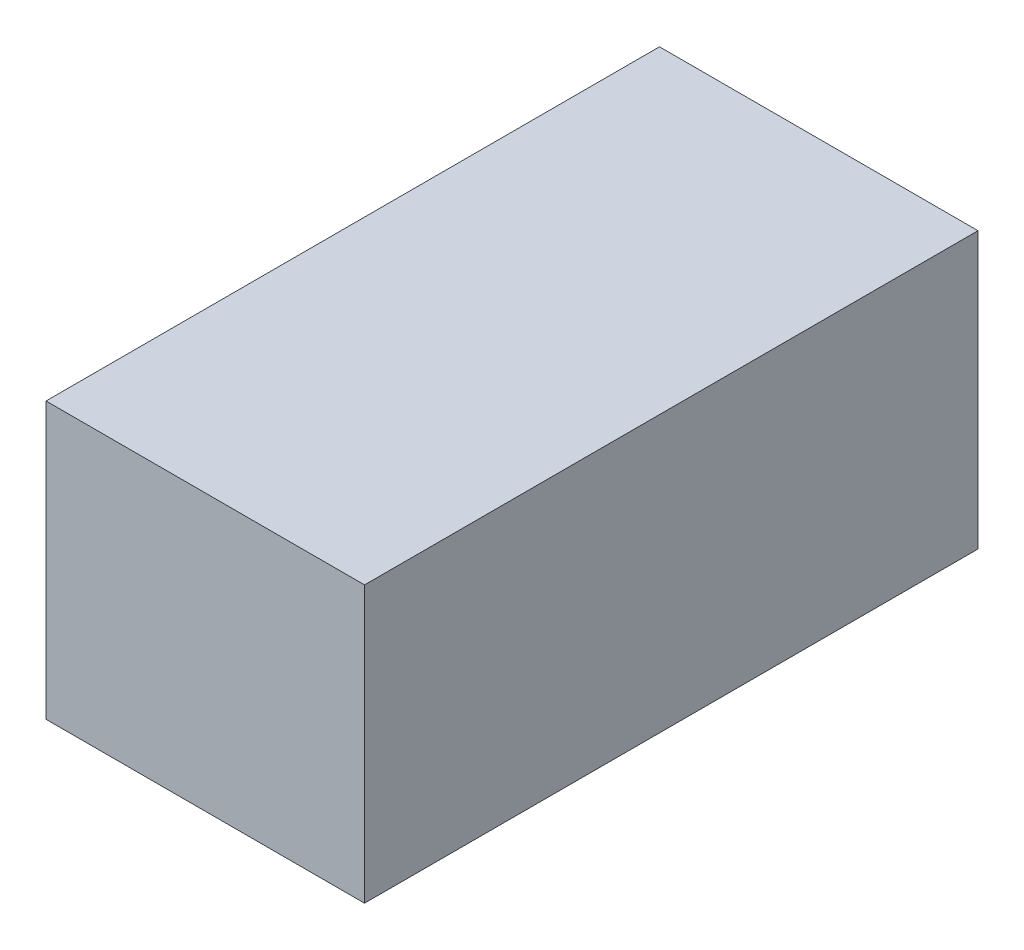
ISO-10303-21;
HEADER;
FILE_DESCRIPTION(('STEP AP214'),'2;1');
FILE_NAME('part.step','',(''),(''),'','','');
FILE_SCHEMA(('AUTOMOTIVE_DESIGN { 1 0 10303 214 1 1 1 1 }'));
ENDSEC;
DATA;
#1=APPLICATION_CONTEXT('core data for automotive mechanical design processes');
#2=APPLICATION_PROTOCOL_DEFINITION('international standard','automotive_design',2000,#1);
#3=PRODUCT_CONTEXT('',#1,'mechanical');
#4=PRODUCT('Part','Part','',(#3));
#5=PRODUCT_RELATED_PRODUCT_CATEGORY('part','',(#4));
#6=PRODUCT_DEFINITION_FORMATION('','',#4);
#7=PRODUCT_DEFINITION_CONTEXT('part definition',#1,'design');
#8=PRODUCT_DEFINITION('design','',#6,#7);
#9=PRODUCT_DEFINITION_SHAPE('','',#8);
#10=(LENGTH_UNIT() NAMED_UNIT(*) SI_UNIT(.MILLI.,.METRE.));
#11=(NAMED_UNIT(*) PLANE_ANGLE_UNIT() SI_UNIT($,.RADIAN.));
#12=(NAMED_UNIT(*) SI_UNIT($,.STERADIAN.) SOLID_ANGLE_UNIT());
#13=UNCERTAINTY_MEASURE_WITH_UNIT(LENGTH_MEASURE(1.E-05),#10,'distance_accuracy_value','');
#14=(GEOMETRIC_REPRESENTATION_CONTEXT(3) GLOBAL_UNCERTAINTY_ASSIGNED_CONTEXT((#13)) GLOBAL_UNIT_ASSIGNED_CONTEXT((#10,
#11,#12)) REPRESENTATION_CONTEXT('',''));
#15=CARTESIAN_POINT('',(0.,0.,0.));
#16=DIRECTION('',(0.,0.,1.));
#17=DIRECTION('',(1.,0.,0.));
#18=AXIS2_PLACEMENT_3D('',#15,#16,#17);
#19=CARTESIAN_POINT('',(-0.607308911055287,2.535,3.45567102980451));
#20=DIRECTION('',(0.,1.,0.));
#21=DIRECTION('',(0.,0.,1.));
#22=AXIS2_PLACEMENT_3D('',#19,#20,#21);
#23=PLANE('',#22);
#24=DIRECTION('',(0.,0.,-1.));
#25=VECTOR('',#24,1.);
#26=CARTESIAN_POINT('',(3.44969080361891,2.535,4.34581442711699));
#27=LINE('',#26,#25);
#28=CARTESIAN_POINT('',(3.44969080361891,2.535,2.56552763249203));
#29=VERTEX_POINT('',#28);
#30=CARTESIAN_POINT('',(3.44969080361891,2.535,4.34581442711699));
#31=VERTEX_POINT('',#30);
#32=EDGE_CURVE('E67',#29,#31,#27,.F.);
#33=ORIENTED_EDGE('',*,*,#32,.F.);
#34=DIRECTION('',(-1.,0.,0.));
#35=VECTOR('',#34,1.);
#36=CARTESIAN_POINT('',(3.44969080361891,2.535,2.56552763249203));
#37=LINE('',#36,#35);
#38=CARTESIAN_POINT('',(2.52531112179441,2.535,2.56552763249203));
#39=VERTEX_POINT('',#38);
#40=EDGE_CURVE('E58',#39,#29,#37,.F.);
#41=ORIENTED_EDGE('',*,*,#40,.F.);
#42=DIRECTION('',(0.,0.,1.));
#43=VECTOR('',#42,1.);
#44=CARTESIAN_POINT('',(2.52531112179441,2.535,2.56552763249203));
#45=LINE('',#44,#43);
#46=CARTESIAN_POINT('',(2.52531112179441,2.535,4.34581442711699));
#47=VERTEX_POINT('',#46);
#48=EDGE_CURVE('E53',#47,#39,#45,.F.);
#49=ORIENTED_EDGE('',*,*,#48,.F.);
#50=DIRECTION('',(1.,0.,0.));
#51=VECTOR('',#50,1.);
#52=CARTESIAN_POINT('',(-0.607308911055287,2.535,4.34581442711699));
#53=LINE('',#52,#51);
#54=EDGE_CURVE('E20',#47,#31,#53,.T.);
#55=ORIENTED_EDGE('',*,*,#54,.T.);
#56=EDGE_LOOP('',(#33,#41,#49,#55));
#57=FACE_BOUND('',#56,.T.);
#58=ADVANCED_FACE('F17',(#57),#23,.T.);
#59=CARTESIAN_POINT('',(3.44969080361891,1.735,4.34581442711699));
#60=DIRECTION('',(1.,0.,0.));
#61=DIRECTION('',(0.,0.,-1.));
#62=AXIS2_PLACEMENT_3D('',#59,#60,#61);
#63=PLANE('',#62);
#64=DIRECTION('',(0.,0.,1.));
#65=VECTOR('',#64,1.);
#66=CARTESIAN_POINT('',(3.44969080361891,1.735,3.45567102980451));
#67=LINE('',#66,#65);
#68=CARTESIAN_POINT('',(3.44969080361891,1.735,4.34581442711699));
#69=VERTEX_POINT('',#68);
#70=CARTESIAN_POINT('',(3.44969080361891,1.735,2.56552763249203));
#71=VERTEX_POINT('',#70);
#72=EDGE_CURVE('E75',#69,#71,#67,.F.);
#73=ORIENTED_EDGE('',*,*,#72,.T.);
#74=DIRECTION('',(0.,1.,0.));
#75=VECTOR('',#74,1.);
#76=CARTESIAN_POINT('',(3.44969080361891,1.735,2.56552763249203));
#77=LINE('',#76,#75);
#78=EDGE_CURVE('E63',#29,#71,#77,.F.);
#79=ORIENTED_EDGE('',*,*,#78,.F.);
#80=ORIENTED_EDGE('',*,*,#32,.T.);
#81=DIRECTION('',(0.,1.,0.));
#82=VECTOR('',#81,1.);
#83=CARTESIAN_POINT('',(3.44969080361891,1.735,4.34581442711699));
#84=LINE('',#83,#82);
#85=EDGE_CURVE('E81',#69,#31,#84,.T.);
#86=ORIENTED_EDGE('',*,*,#85,.F.);
#87=EDGE_LOOP('',(#73,#79,#80,#86));
#88=FACE_BOUND('',#87,.T.);
#89=ADVANCED_FACE('F74',(#88),#63,.T.);
#90=CARTESIAN_POINT('',(3.44969080361891,1.735,2.56552763249203));
#91=DIRECTION('',(0.,0.,-1.));
#92=DIRECTION('',(-1.,0.,0.));
#93=AXIS2_PLACEMENT_3D('',#90,#91,#92);
#94=PLANE('',#93);
#95=DIRECTION('',(1.,0.,0.));
#96=VECTOR('',#95,1.);
#97=CARTESIAN_POINT('',(2.98750096270666,1.735,2.56552763249203));
#98=LINE('',#97,#96);
#99=CARTESIAN_POINT('',(2.52531112179441,1.735,2.56552763249203));
#100=VERTEX_POINT('',#99);
#101=EDGE_CURVE('E84',#71,#100,#98,.F.);
#102=ORIENTED_EDGE('',*,*,#101,.T.);
#103=DIRECTION('',(0.,1.,0.));
#104=VECTOR('',#103,1.);
#105=CARTESIAN_POINT('',(2.52531112179441,1.735,2.56552763249203));
#106=LINE('',#105,#104);
#107=EDGE_CURVE('E65',#39,#100,#106,.F.);
#108=ORIENTED_EDGE('',*,*,#107,.F.);
#109=ORIENTED_EDGE('',*,*,#40,.T.);
#110=ORIENTED_EDGE('',*,*,#78,.T.);
#111=EDGE_LOOP('',(#102,#108,#109,#110));
#112=FACE_BOUND('',#111,.T.);
#113=ADVANCED_FACE('F61',(#112),#94,.T.);
#114=CARTESIAN_POINT('',(2.52531112179441,1.735,2.56552763249203));
#115=DIRECTION('',(-1.,0.,0.));
#116=DIRECTION('',(0.,0.,1.));
#117=AXIS2_PLACEMENT_3D('',#114,#115,#116);
#118=PLANE('',#117);
#119=DIRECTION('',(0.,0.,1.));
#120=VECTOR('',#119,1.);
#121=CARTESIAN_POINT('',(2.52531112179441,1.735,3.45567102980451));
#122=LINE('',#121,#120);
#123=CARTESIAN_POINT('',(2.52531112179441,1.735,4.34581442711699));
#124=VERTEX_POINT('',#123);
#125=EDGE_CURVE('E26',#100,#124,#122,.T.);
#126=ORIENTED_EDGE('',*,*,#125,.T.);
#127=DIRECTION('',(0.,1.,0.));
#128=VECTOR('',#127,1.);
#129=CARTESIAN_POINT('',(2.52531112179441,1.735,4.34581442711699));
#130=LINE('',#129,#128);
#131=EDGE_CURVE('E34',#47,#124,#130,.F.);
#132=ORIENTED_EDGE('',*,*,#131,.F.);
#133=ORIENTED_EDGE('',*,*,#48,.T.);
#134=ORIENTED_EDGE('',*,*,#107,.T.);
#135=EDGE_LOOP('',(#126,#132,#133,#134));
#136=FACE_BOUND('',#135,.T.);
#137=ADVANCED_FACE('F88',(#136),#118,.T.);
#138=CARTESIAN_POINT('',(2.52531112179441,1.735,4.34581442711699));
#139=DIRECTION('',(0.,0.,1.));
#140=DIRECTION('',(1.,0.,0.));
#141=AXIS2_PLACEMENT_3D('',#138,#139,#140);
#142=PLANE('',#141);
#143=DIRECTION('',(1.,0.,0.));
#144=VECTOR('',#143,1.);
#145=CARTESIAN_POINT('',(2.98750096270666,1.735,4.34581442711699));
#146=LINE('',#145,#144);
#147=EDGE_CURVE('E11',#124,#69,#146,.T.);
#148=ORIENTED_EDGE('',*,*,#147,.T.);
#149=ORIENTED_EDGE('',*,*,#85,.T.);
#150=ORIENTED_EDGE('',*,*,#54,.F.);
#151=ORIENTED_EDGE('',*,*,#131,.T.);
#152=EDGE_LOOP('',(#148,#149,#150,#151));
#153=FACE_BOUND('',#152,.T.);
#154=ADVANCED_FACE('F91',(#153),#142,.T.);
#155=CARTESIAN_POINT('',(2.98750096270666,1.735,3.45567102980451));
#156=DIRECTION('',(0.,1.,0.));
#157=DIRECTION('',(0.,0.,1.));
#158=AXIS2_PLACEMENT_3D('',#155,#156,#157);
#159=PLANE('',#158);
#160=ORIENTED_EDGE('',*,*,#125,.F.);
#161=ORIENTED_EDGE('',*,*,#101,.F.);
#162=ORIENTED_EDGE('',*,*,#72,.F.);
#163=ORIENTED_EDGE('',*,*,#147,.F.);
#164=EDGE_LOOP('',(#160,#161,#162,#163));
#165=FACE_BOUND('',#164,.T.);
#166=ADVANCED_FACE('F90',(#165),#159,.F.);
#167=CLOSED_SHELL('',(#58,#89,#113,#137,#154,#166));
#168=MANIFOLD_SOLID_BREP('B1',#167);
#169=ADVANCED_BREP_SHAPE_REPRESENTATION('',(#18,#168),#14);
#170=SHAPE_DEFINITION_REPRESENTATION(#9,#169);
ENDSEC;
END-ISO-10303-21;
